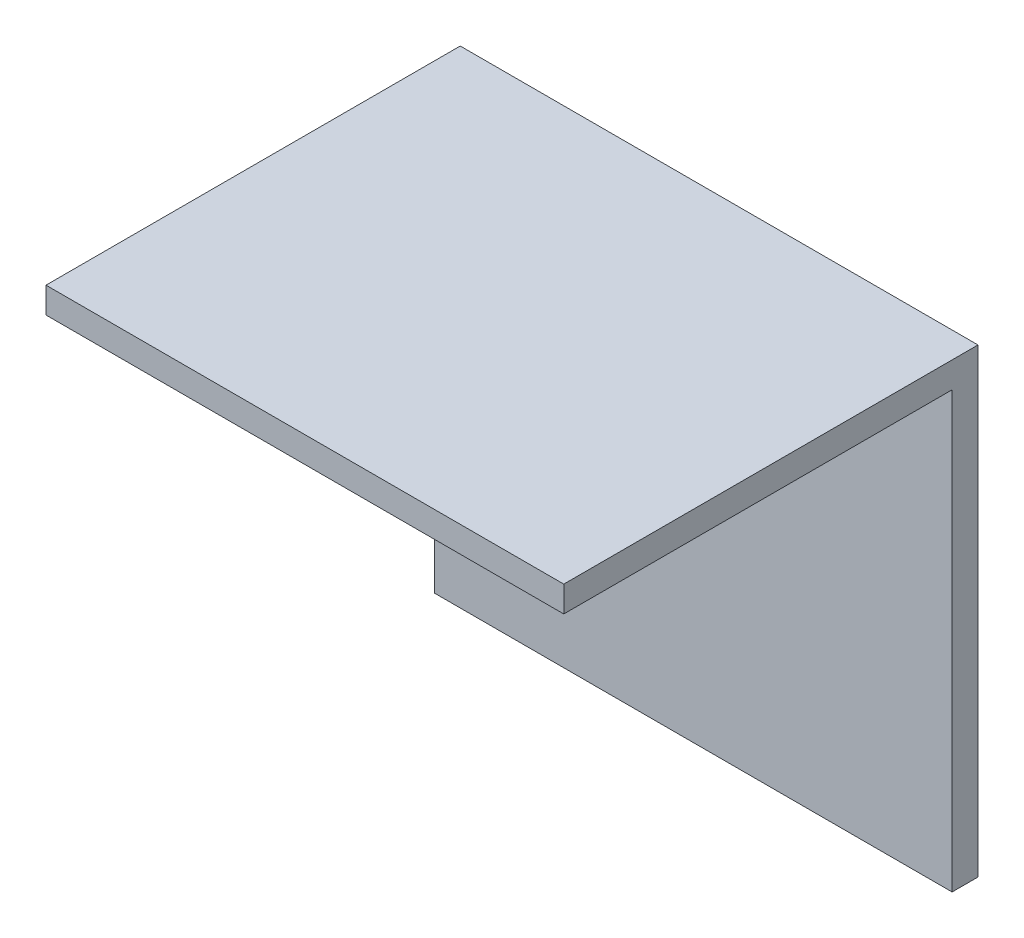
ISO-10303-21;
HEADER;
FILE_DESCRIPTION(('STEP AP214'),'2;1');
FILE_NAME('part.step','',(''),(''),'','','');
FILE_SCHEMA(('AUTOMOTIVE_DESIGN { 1 0 10303 214 1 1 1 1 }'));
ENDSEC;
DATA;
#1=APPLICATION_CONTEXT('core data for automotive mechanical design processes');
#2=APPLICATION_PROTOCOL_DEFINITION('international standard','automotive_design',2000,#1);
#3=PRODUCT_CONTEXT('',#1,'mechanical');
#4=PRODUCT('Part','Part','',(#3));
#5=PRODUCT_RELATED_PRODUCT_CATEGORY('part','',(#4));
#6=PRODUCT_DEFINITION_FORMATION('','',#4);
#7=PRODUCT_DEFINITION_CONTEXT('part definition',#1,'design');
#8=PRODUCT_DEFINITION('design','',#6,#7);
#9=PRODUCT_DEFINITION_SHAPE('','',#8);
#10=(LENGTH_UNIT() NAMED_UNIT(*) SI_UNIT(.MILLI.,.METRE.));
#11=(NAMED_UNIT(*) PLANE_ANGLE_UNIT() SI_UNIT($,.RADIAN.));
#12=(NAMED_UNIT(*) SI_UNIT($,.STERADIAN.) SOLID_ANGLE_UNIT());
#13=UNCERTAINTY_MEASURE_WITH_UNIT(LENGTH_MEASURE(1.E-05),#10,'distance_accuracy_value','');
#14=(GEOMETRIC_REPRESENTATION_CONTEXT(3) GLOBAL_UNCERTAINTY_ASSIGNED_CONTEXT((#13)) GLOBAL_UNIT_ASSIGNED_CONTEXT((#10,
#11,#12)) REPRESENTATION_CONTEXT('',''));
#15=CARTESIAN_POINT('',(0.,0.,0.));
#16=DIRECTION('',(0.,0.,1.));
#17=DIRECTION('',(1.,0.,0.));
#18=AXIS2_PLACEMENT_3D('',#15,#16,#17);
#19=CARTESIAN_POINT('',(0.,0.,10.));
#20=DIRECTION('',(0.,0.,-1.));
#21=DIRECTION('',(-1.,0.,0.));
#22=AXIS2_PLACEMENT_3D('',#19,#20,#21);
#23=PLANE('',#22);
#24=CARTESIAN_POINT('',(-231.685557970627,-0.111199999999992,10.));
#25=DIRECTION('',(0.,0.,-1.));
#26=DIRECTION('',(-1.,0.,0.));
#27=AXIS2_PLACEMENT_3D('',#24,#25,#26);
#28=CIRCLE('',#27,5.00000000000002);
#29=CARTESIAN_POINT('',(-236.685557970627,-0.111199999999992,10.));
#30=VERTEX_POINT('',#29);
#31=EDGE_CURVE('E144',#30,#30,#28,.T.);
#32=ORIENTED_EDGE('',*,*,#31,.T.);
#33=EDGE_LOOP('',(#32));
#34=FACE_BOUND('',#33,.T.);
#35=DIRECTION('',(1.,0.,0.));
#36=VECTOR('',#35,1.);
#37=CARTESIAN_POINT('',(-298.352557970627,79.,10.));
#38=LINE('',#37,#36);
#39=CARTESIAN_POINT('',(-298.352557970627,79.,10.));
#40=VERTEX_POINT('',#39);
#41=CARTESIAN_POINT('',(-98.3525579706273,79.,10.));
#42=VERTEX_POINT('',#41);
#43=EDGE_CURVE('E56',#40,#42,#38,.T.);
#44=ORIENTED_EDGE('',*,*,#43,.F.);
#45=DIRECTION('',(0.,-1.,0.));
#46=VECTOR('',#45,1.);
#47=CARTESIAN_POINT('',(-298.352557970627,-89.,10.));
#48=LINE('',#47,#46);
#49=CARTESIAN_POINT('',(-298.352557970627,-89.,10.));
#50=VERTEX_POINT('',#49);
#51=EDGE_CURVE('E93',#40,#50,#48,.T.);
#52=ORIENTED_EDGE('',*,*,#51,.T.);
#53=DIRECTION('',(1.,0.,0.));
#54=VECTOR('',#53,1.);
#55=CARTESIAN_POINT('',(-298.352557970627,-89.,10.));
#56=LINE('',#55,#54);
#57=CARTESIAN_POINT('',(-98.3525579706273,-89.,10.));
#58=VERTEX_POINT('',#57);
#59=EDGE_CURVE('E62',#50,#58,#56,.T.);
#60=ORIENTED_EDGE('',*,*,#59,.T.);
#61=DIRECTION('',(0.,1.,0.));
#62=VECTOR('',#61,1.);
#63=CARTESIAN_POINT('',(-98.3525579706273,-89.,10.));
#64=LINE('',#63,#62);
#65=EDGE_CURVE('E104',#58,#42,#64,.T.);
#66=ORIENTED_EDGE('',*,*,#65,.T.);
#67=EDGE_LOOP('',(#44,#52,#60,#66));
#68=FACE_BOUND('',#67,.T.);
#69=ADVANCED_FACE('F41',(#34,#68),#23,.F.);
#70=CARTESIAN_POINT('',(-298.352557970627,-89.,10.));
#71=DIRECTION('',(1.,0.,0.));
#72=DIRECTION('',(0.,1.,0.));
#73=AXIS2_PLACEMENT_3D('',#70,#71,#72);
#74=PLANE('',#73);
#75=DIRECTION('',(0.,-1.,0.));
#76=VECTOR('',#75,1.);
#77=CARTESIAN_POINT('',(-298.352557970627,-89.,0.));
#78=LINE('',#77,#76);
#79=CARTESIAN_POINT('',(-298.352557970627,89.,0.));
#80=VERTEX_POINT('',#79);
#81=CARTESIAN_POINT('',(-298.352557970627,-89.,0.));
#82=VERTEX_POINT('',#81);
#83=EDGE_CURVE('E100',#80,#82,#78,.T.);
#84=ORIENTED_EDGE('',*,*,#83,.T.);
#85=DIRECTION('',(0.,0.,-1.));
#86=VECTOR('',#85,1.);
#87=CARTESIAN_POINT('',(-298.352557970627,-89.,10.));
#88=LINE('',#87,#86);
#89=EDGE_CURVE('E11',#50,#82,#88,.T.);
#90=ORIENTED_EDGE('',*,*,#89,.F.);
#91=ORIENTED_EDGE('',*,*,#51,.F.);
#92=DIRECTION('',(0.,0.,-1.));
#93=VECTOR('',#92,1.);
#94=CARTESIAN_POINT('',(-298.352557970627,79.,160.));
#95=LINE('',#94,#93);
#96=CARTESIAN_POINT('',(-298.352557970627,79.,160.));
#97=VERTEX_POINT('',#96);
#98=EDGE_CURVE('E108',#97,#40,#95,.T.);
#99=ORIENTED_EDGE('',*,*,#98,.F.);
#100=DIRECTION('',(0.,-1.,0.));
#101=VECTOR('',#100,1.);
#102=CARTESIAN_POINT('',(-298.352557970627,89.,160.));
#103=LINE('',#102,#101);
#104=CARTESIAN_POINT('',(-298.352557970627,89.,160.));
#105=VERTEX_POINT('',#104);
#106=EDGE_CURVE('E103',#105,#97,#103,.T.);
#107=ORIENTED_EDGE('',*,*,#106,.F.);
#108=DIRECTION('',(0.,0.,-1.));
#109=VECTOR('',#108,1.);
#110=CARTESIAN_POINT('',(-298.352557970627,89.,10.));
#111=LINE('',#110,#109);
#112=EDGE_CURVE('E86',#105,#80,#111,.T.);
#113=ORIENTED_EDGE('',*,*,#112,.T.);
#114=EDGE_LOOP('',(#84,#90,#91,#99,#107,#113));
#115=FACE_BOUND('',#114,.T.);
#116=ADVANCED_FACE('F43',(#115),#74,.F.);
#117=CARTESIAN_POINT('',(-298.352557970627,-89.,10.));
#118=DIRECTION('',(0.,1.,0.));
#119=DIRECTION('',(0.,0.,1.));
#120=AXIS2_PLACEMENT_3D('',#117,#118,#119);
#121=PLANE('',#120);
#122=DIRECTION('',(1.,0.,0.));
#123=VECTOR('',#122,1.);
#124=CARTESIAN_POINT('',(-298.352557970627,-89.,0.));
#125=LINE('',#124,#123);
#126=CARTESIAN_POINT('',(-98.3525579706273,-89.,0.));
#127=VERTEX_POINT('',#126);
#128=EDGE_CURVE('E107',#82,#127,#125,.T.);
#129=ORIENTED_EDGE('',*,*,#128,.T.);
#130=DIRECTION('',(0.,0.,-1.));
#131=VECTOR('',#130,1.);
#132=CARTESIAN_POINT('',(-98.3525579706273,-89.,10.));
#133=LINE('',#132,#131);
#134=EDGE_CURVE('E49',#58,#127,#133,.T.);
#135=ORIENTED_EDGE('',*,*,#134,.F.);
#136=ORIENTED_EDGE('',*,*,#59,.F.);
#137=ORIENTED_EDGE('',*,*,#89,.T.);
#138=EDGE_LOOP('',(#129,#135,#136,#137));
#139=FACE_BOUND('',#138,.T.);
#140=ADVANCED_FACE('F124',(#139),#121,.F.);
#141=CARTESIAN_POINT('',(-98.3525579706273,-89.,10.));
#142=DIRECTION('',(-1.,0.,0.));
#143=DIRECTION('',(0.,0.,1.));
#144=AXIS2_PLACEMENT_3D('',#141,#142,#143);
#145=PLANE('',#144);
#146=DIRECTION('',(0.,1.,0.));
#147=VECTOR('',#146,1.);
#148=CARTESIAN_POINT('',(-98.3525579706273,-89.,0.));
#149=LINE('',#148,#147);
#150=CARTESIAN_POINT('',(-98.3525579706273,89.,0.));
#151=VERTEX_POINT('',#150);
#152=EDGE_CURVE('E94',#127,#151,#149,.T.);
#153=ORIENTED_EDGE('',*,*,#152,.T.);
#154=DIRECTION('',(0.,0.,-1.));
#155=VECTOR('',#154,1.);
#156=CARTESIAN_POINT('',(-98.3525579706273,89.,10.));
#157=LINE('',#156,#155);
#158=CARTESIAN_POINT('',(-98.3525579706273,89.,160.));
#159=VERTEX_POINT('',#158);
#160=EDGE_CURVE('E89',#159,#151,#157,.T.);
#161=ORIENTED_EDGE('',*,*,#160,.F.);
#162=DIRECTION('',(0.,1.,0.));
#163=VECTOR('',#162,1.);
#164=CARTESIAN_POINT('',(-98.3525579706273,89.,160.));
#165=LINE('',#164,#163);
#166=CARTESIAN_POINT('',(-98.3525579706273,79.,160.));
#167=VERTEX_POINT('',#166);
#168=EDGE_CURVE('E139',#167,#159,#165,.T.);
#169=ORIENTED_EDGE('',*,*,#168,.F.);
#170=DIRECTION('',(0.,0.,-1.));
#171=VECTOR('',#170,1.);
#172=CARTESIAN_POINT('',(-98.3525579706273,79.,160.));
#173=LINE('',#172,#171);
#174=EDGE_CURVE('E112',#167,#42,#173,.T.);
#175=ORIENTED_EDGE('',*,*,#174,.T.);
#176=ORIENTED_EDGE('',*,*,#65,.F.);
#177=ORIENTED_EDGE('',*,*,#134,.T.);
#178=EDGE_LOOP('',(#153,#161,#169,#175,#176,#177));
#179=FACE_BOUND('',#178,.T.);
#180=ADVANCED_FACE('F121',(#179),#145,.F.);
#181=CARTESIAN_POINT('',(-298.352557970627,89.,10.));
#182=DIRECTION('',(0.,-1.,0.));
#183=DIRECTION('',(0.,0.,-1.));
#184=AXIS2_PLACEMENT_3D('',#181,#182,#183);
#185=PLANE('',#184);
#186=DIRECTION('',(-1.,0.,0.));
#187=VECTOR('',#186,1.);
#188=CARTESIAN_POINT('',(-298.352557970627,89.,0.));
#189=LINE('',#188,#187);
#190=EDGE_CURVE('E82',#151,#80,#189,.T.);
#191=ORIENTED_EDGE('',*,*,#190,.T.);
#192=ORIENTED_EDGE('',*,*,#112,.F.);
#193=DIRECTION('',(-1.,0.,0.));
#194=VECTOR('',#193,1.);
#195=CARTESIAN_POINT('',(-298.352557970627,89.,160.));
#196=LINE('',#195,#194);
#197=EDGE_CURVE('E142',#159,#105,#196,.T.);
#198=ORIENTED_EDGE('',*,*,#197,.F.);
#199=ORIENTED_EDGE('',*,*,#160,.T.);
#200=EDGE_LOOP('',(#191,#192,#198,#199));
#201=FACE_BOUND('',#200,.T.);
#202=ADVANCED_FACE('F84',(#201),#185,.F.);
#203=CARTESIAN_POINT('',(0.,0.,0.));
#204=DIRECTION('',(0.,0.,-1.));
#205=DIRECTION('',(-1.,0.,0.));
#206=AXIS2_PLACEMENT_3D('',#203,#204,#205);
#207=PLANE('',#206);
#208=CARTESIAN_POINT('',(-231.685557970627,-0.111199999999992,0.));
#209=DIRECTION('',(0.,0.,1.));
#210=DIRECTION('',(1.,0.,0.));
#211=AXIS2_PLACEMENT_3D('',#208,#209,#210);
#212=CIRCLE('',#211,5.00000000000002);
#213=CARTESIAN_POINT('',(-226.685557970627,-0.111199999999992,0.));
#214=VERTEX_POINT('',#213);
#215=EDGE_CURVE('E260',#214,#214,#212,.T.);
#216=ORIENTED_EDGE('',*,*,#215,.T.);
#217=EDGE_LOOP('',(#216));
#218=FACE_BOUND('',#217,.T.);
#219=ORIENTED_EDGE('',*,*,#83,.F.);
#220=ORIENTED_EDGE('',*,*,#190,.F.);
#221=ORIENTED_EDGE('',*,*,#152,.F.);
#222=ORIENTED_EDGE('',*,*,#128,.F.);
#223=EDGE_LOOP('',(#219,#220,#221,#222));
#224=FACE_BOUND('',#223,.T.);
#225=ADVANCED_FACE('F106',(#218,#224),#207,.T.);
#226=CARTESIAN_POINT('',(-298.352557970627,79.,160.));
#227=DIRECTION('',(0.,1.,0.));
#228=DIRECTION('',(-1.,0.,0.));
#229=AXIS2_PLACEMENT_3D('',#226,#227,#228);
#230=PLANE('',#229);
#231=ORIENTED_EDGE('',*,*,#43,.T.);
#232=ORIENTED_EDGE('',*,*,#174,.F.);
#233=DIRECTION('',(1.,0.,0.));
#234=VECTOR('',#233,1.);
#235=CARTESIAN_POINT('',(-298.352557970627,79.,160.));
#236=LINE('',#235,#234);
#237=EDGE_CURVE('E133',#97,#167,#236,.T.);
#238=ORIENTED_EDGE('',*,*,#237,.F.);
#239=ORIENTED_EDGE('',*,*,#98,.T.);
#240=EDGE_LOOP('',(#231,#232,#238,#239));
#241=FACE_BOUND('',#240,.T.);
#242=ADVANCED_FACE('F129',(#241),#230,.F.);
#243=CARTESIAN_POINT('',(0.,0.,160.));
#244=DIRECTION('',(0.,0.,1.));
#245=DIRECTION('',(1.,0.,0.));
#246=AXIS2_PLACEMENT_3D('',#243,#244,#245);
#247=PLANE('',#246);
#248=ORIENTED_EDGE('',*,*,#106,.T.);
#249=ORIENTED_EDGE('',*,*,#237,.T.);
#250=ORIENTED_EDGE('',*,*,#168,.T.);
#251=ORIENTED_EDGE('',*,*,#197,.T.);
#252=EDGE_LOOP('',(#248,#249,#250,#251));
#253=FACE_BOUND('',#252,.T.);
#254=ADVANCED_FACE('F141',(#253),#247,.T.);
#255=CARTESIAN_POINT('',(-231.685557970627,-0.111199999999992,0.));
#256=DIRECTION('',(0.,0.,1.));
#257=DIRECTION('',(1.,0.,0.));
#258=AXIS2_PLACEMENT_3D('',#255,#256,#257);
#259=CYLINDRICAL_SURFACE('',#258,5.00000000000002);
#260=ORIENTED_EDGE('',*,*,#215,.F.);
#261=EDGE_LOOP('',(#260));
#262=FACE_BOUND('',#261,.T.);
#263=ORIENTED_EDGE('',*,*,#31,.F.);
#264=EDGE_LOOP('',(#263));
#265=FACE_BOUND('',#264,.T.);
#266=ADVANCED_FACE('F200',(#262,#265),#259,.F.);
#267=CLOSED_SHELL('',(#69,#116,#140,#180,#202,#225,#242,#254,#266));
#268=MANIFOLD_SOLID_BREP('B2',#267);
#269=ADVANCED_BREP_SHAPE_REPRESENTATION('',(#18,#268),#14);
#270=SHAPE_DEFINITION_REPRESENTATION(#9,#269);
ENDSEC;
END-ISO-10303-21;
